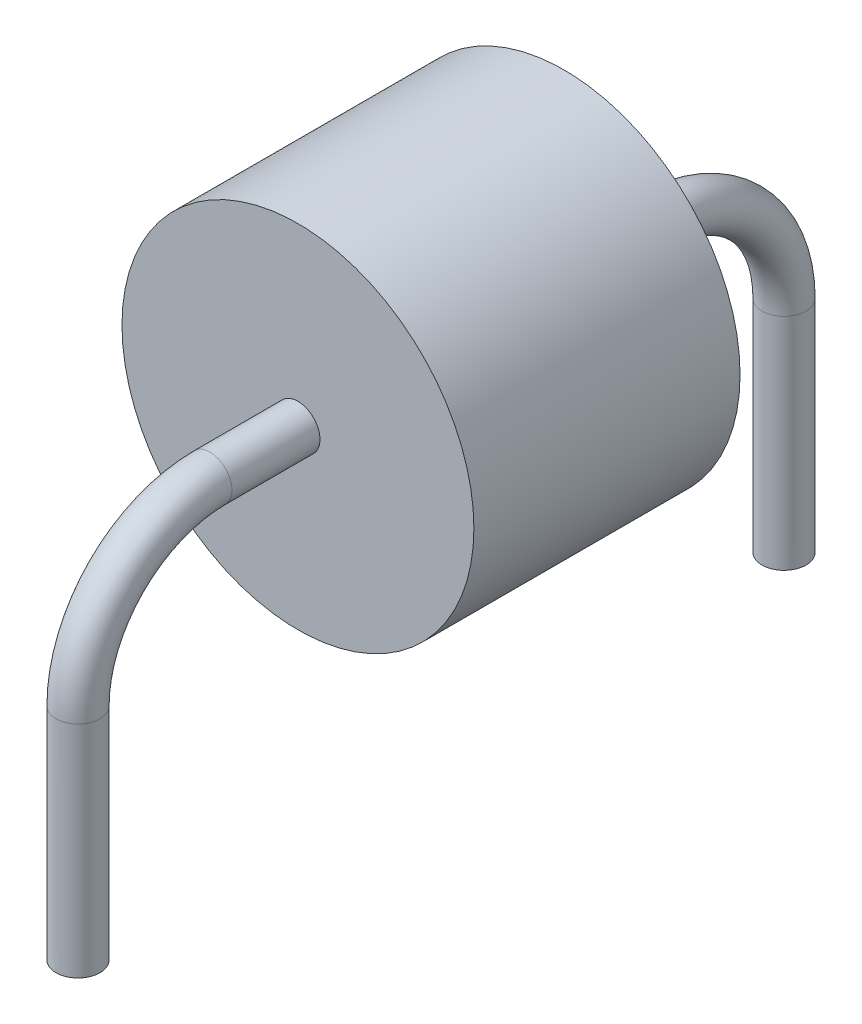
ISO-10303-21;
HEADER;
FILE_DESCRIPTION(('STEP AP214'),'2;1');
FILE_NAME('part.step','',(''),(''),'','','');
FILE_SCHEMA(('AUTOMOTIVE_DESIGN { 1 0 10303 214 1 1 1 1 }'));
ENDSEC;
DATA;
#1=APPLICATION_CONTEXT('core data for automotive mechanical design processes');
#2=APPLICATION_PROTOCOL_DEFINITION('international standard','automotive_design',2000,#1);
#3=PRODUCT_CONTEXT('',#1,'mechanical');
#4=PRODUCT('Part','Part','',(#3));
#5=PRODUCT_RELATED_PRODUCT_CATEGORY('part','',(#4));
#6=PRODUCT_DEFINITION_FORMATION('','',#4);
#7=PRODUCT_DEFINITION_CONTEXT('part definition',#1,'design');
#8=PRODUCT_DEFINITION('design','',#6,#7);
#9=PRODUCT_DEFINITION_SHAPE('','',#8);
#10=(LENGTH_UNIT() NAMED_UNIT(*) SI_UNIT(.MILLI.,.METRE.));
#11=(NAMED_UNIT(*) PLANE_ANGLE_UNIT() SI_UNIT($,.RADIAN.));
#12=(NAMED_UNIT(*) SI_UNIT($,.STERADIAN.) SOLID_ANGLE_UNIT());
#13=UNCERTAINTY_MEASURE_WITH_UNIT(LENGTH_MEASURE(1.E-05),#10,'distance_accuracy_value','');
#14=(GEOMETRIC_REPRESENTATION_CONTEXT(3) GLOBAL_UNCERTAINTY_ASSIGNED_CONTEXT((#13)) GLOBAL_UNIT_ASSIGNED_CONTEXT((#10,
#11,#12)) REPRESENTATION_CONTEXT('',''));
#15=CARTESIAN_POINT('',(0.,0.,0.));
#16=DIRECTION('',(0.,0.,1.));
#17=DIRECTION('',(1.,0.,0.));
#18=AXIS2_PLACEMENT_3D('',#15,#16,#17);
#19=CARTESIAN_POINT('',(0.,0.,3.025));
#20=DIRECTION('',(0.,0.,-1.));
#21=DIRECTION('',(-1.,0.,0.));
#22=AXIS2_PLACEMENT_3D('',#19,#20,#21);
#23=CYLINDRICAL_SURFACE('',#22,4.);
#24=CARTESIAN_POINT('',(0.,0.,3.025));
#25=DIRECTION('',(0.,0.,1.));
#26=DIRECTION('',(1.,0.,0.));
#27=AXIS2_PLACEMENT_3D('',#24,#25,#26);
#28=CIRCLE('',#27,4.);
#29=CARTESIAN_POINT('',(4.,0.,3.025));
#30=VERTEX_POINT('',#29);
#31=EDGE_CURVE('E39',#30,#30,#28,.T.);
#32=ORIENTED_EDGE('',*,*,#31,.F.);
#33=EDGE_LOOP('',(#32));
#34=FACE_BOUND('',#33,.T.);
#35=CARTESIAN_POINT('',(0.,0.,-3.025));
#36=DIRECTION('',(0.,0.,1.));
#37=DIRECTION('',(1.,0.,0.));
#38=AXIS2_PLACEMENT_3D('',#35,#36,#37);
#39=CIRCLE('',#38,4.);
#40=CARTESIAN_POINT('',(4.,0.,-3.025));
#41=VERTEX_POINT('',#40);
#42=EDGE_CURVE('E43',#41,#41,#39,.T.);
#43=ORIENTED_EDGE('',*,*,#42,.T.);
#44=EDGE_LOOP('',(#43));
#45=FACE_BOUND('',#44,.T.);
#46=ADVANCED_FACE('F33',(#34,#45),#23,.T.);
#47=CARTESIAN_POINT('',(0.,0.,3.025));
#48=DIRECTION('',(0.,0.,1.));
#49=DIRECTION('',(1.,0.,0.));
#50=AXIS2_PLACEMENT_3D('',#47,#48,#49);
#51=PLANE('',#50);
#52=CARTESIAN_POINT('',(0.,0.,3.025));
#53=DIRECTION('',(0.,0.,1.));
#54=DIRECTION('',(1.,0.,0.));
#55=AXIS2_PLACEMENT_3D('',#52,#53,#54);
#56=CIRCLE('',#55,0.5);
#57=CARTESIAN_POINT('',(0.5,0.,3.025));
#58=VERTEX_POINT('',#57);
#59=EDGE_CURVE('E10',#58,#58,#56,.T.);
#60=ORIENTED_EDGE('',*,*,#59,.F.);
#61=EDGE_LOOP('',(#60));
#62=FACE_BOUND('',#61,.T.);
#63=ORIENTED_EDGE('',*,*,#31,.T.);
#64=EDGE_LOOP('',(#63));
#65=FACE_BOUND('',#64,.T.);
#66=ADVANCED_FACE('F77',(#62,#65),#51,.T.);
#67=CARTESIAN_POINT('',(0.,0.,-3.025));
#68=DIRECTION('',(0.,0.,1.));
#69=DIRECTION('',(1.,0.,0.));
#70=AXIS2_PLACEMENT_3D('',#67,#68,#69);
#71=PLANE('',#70);
#72=CARTESIAN_POINT('',(0.,0.,-3.025));
#73=DIRECTION('',(0.,0.,1.));
#74=DIRECTION('',(1.,0.,0.));
#75=AXIS2_PLACEMENT_3D('',#72,#73,#74);
#76=CIRCLE('',#75,0.5);
#77=CARTESIAN_POINT('',(0.5,0.,-3.025));
#78=VERTEX_POINT('',#77);
#79=EDGE_CURVE('E67',#78,#78,#76,.F.);
#80=ORIENTED_EDGE('',*,*,#79,.F.);
#81=EDGE_LOOP('',(#80));
#82=FACE_BOUND('',#81,.T.);
#83=ORIENTED_EDGE('',*,*,#42,.F.);
#84=EDGE_LOOP('',(#83));
#85=FACE_BOUND('',#84,.T.);
#86=ADVANCED_FACE('F73',(#82,#85),#71,.F.);
#87=CARTESIAN_POINT('',(0.,-8.,8.025));
#88=DIRECTION('',(0.,-1.,0.));
#89=DIRECTION('',(1.,0.,0.));
#90=AXIS2_PLACEMENT_3D('',#87,#88,#89);
#91=PLANE('',#90);
#92=CARTESIAN_POINT('',(0.,-8.,8.025));
#93=DIRECTION('',(0.,-1.,0.));
#94=DIRECTION('',(1.,0.,0.));
#95=AXIS2_PLACEMENT_3D('',#92,#93,#94);
#96=CIRCLE('',#95,0.5);
#97=CARTESIAN_POINT('',(0.5,-8.,8.025));
#98=VERTEX_POINT('',#97);
#99=EDGE_CURVE('E48',#98,#98,#96,.T.);
#100=ORIENTED_EDGE('',*,*,#99,.T.);
#101=EDGE_LOOP('',(#100));
#102=FACE_BOUND('',#101,.T.);
#103=ADVANCED_FACE('F76',(#102),#91,.T.);
#104=CARTESIAN_POINT('',(0.,0.,3.025));
#105=DIRECTION('',(0.,0.,1.));
#106=DIRECTION('',(0.,-1.,0.));
#107=AXIS2_PLACEMENT_3D('',#104,#105,#106);
#108=CYLINDRICAL_SURFACE('',#107,0.5);
#109=CARTESIAN_POINT('',(0.,0.,5.025));
#110=DIRECTION('',(0.,0.,1.));
#111=DIRECTION('',(1.,0.,0.));
#112=AXIS2_PLACEMENT_3D('',#109,#110,#111);
#113=CIRCLE('',#112,0.5);
#114=CARTESIAN_POINT('',(0.,0.499999999999998,5.025));
#115=VERTEX_POINT('',#114);
#116=EDGE_CURVE('E55',#115,#115,#113,.T.);
#117=ORIENTED_EDGE('',*,*,#116,.F.);
#118=EDGE_LOOP('',(#117));
#119=FACE_BOUND('',#118,.T.);
#120=ORIENTED_EDGE('',*,*,#59,.T.);
#121=EDGE_LOOP('',(#120));
#122=FACE_BOUND('',#121,.T.);
#123=ADVANCED_FACE('F93',(#119,#122),#108,.T.);
#124=CARTESIAN_POINT('',(0.,-3.,5.025));
#125=DIRECTION('',(1.,0.,0.));
#126=DIRECTION('',(0.,0.,-1.));
#127=AXIS2_PLACEMENT_3D('',#124,#125,#126);
#128=TOROIDAL_SURFACE('',#127,3.,0.5);
#129=CARTESIAN_POINT('',(0.,-3.,8.025));
#130=DIRECTION('',(0.,-1.,0.));
#131=DIRECTION('',(1.,0.,0.));
#132=AXIS2_PLACEMENT_3D('',#129,#130,#131);
#133=CIRCLE('',#132,0.5);
#134=CARTESIAN_POINT('',(0.,-3.,8.525));
#135=VERTEX_POINT('',#134);
#136=EDGE_CURVE('E52',#135,#135,#133,.T.);
#137=CARTESIAN_POINT('',(0.,-3.,5.025));
#138=DIRECTION('',(1.,0.,0.));
#139=DIRECTION('',(0.,0.,-1.));
#140=AXIS2_PLACEMENT_3D('',#137,#138,#139);
#141=CIRCLE('',#140,3.5);
#142=EDGE_CURVE('',#115,#135,#141,.T.);
#143=ORIENTED_EDGE('',*,*,#116,.T.);
#144=ORIENTED_EDGE('',*,*,#136,.F.);
#145=ORIENTED_EDGE('',*,*,#142,.T.);
#146=ORIENTED_EDGE('',*,*,#142,.F.);
#147=EDGE_LOOP('',(#143,#145,#144,#146));
#148=FACE_BOUND('',#147,.T.);
#149=ADVANCED_FACE('F99',(#148),#128,.T.);
#150=CARTESIAN_POINT('',(0.,-3.,8.025));
#151=DIRECTION('',(0.,-1.,0.));
#152=DIRECTION('',(0.,0.,-1.));
#153=AXIS2_PLACEMENT_3D('',#150,#151,#152);
#154=CYLINDRICAL_SURFACE('',#153,0.5);
#155=ORIENTED_EDGE('',*,*,#99,.F.);
#156=EDGE_LOOP('',(#155));
#157=FACE_BOUND('',#156,.T.);
#158=ORIENTED_EDGE('',*,*,#136,.T.);
#159=EDGE_LOOP('',(#158));
#160=FACE_BOUND('',#159,.T.);
#161=ADVANCED_FACE('F78',(#157,#160),#154,.T.);
#162=CARTESIAN_POINT('',(0.,-8.,-8.025));
#163=DIRECTION('',(0.,-1.,0.));
#164=DIRECTION('',(1.,0.,0.));
#165=AXIS2_PLACEMENT_3D('',#162,#163,#164);
#166=PLANE('',#165);
#167=CARTESIAN_POINT('',(0.,-8.,-8.025));
#168=DIRECTION('',(0.,1.,0.));
#169=DIRECTION('',(1.,0.,0.));
#170=AXIS2_PLACEMENT_3D('',#167,#168,#169);
#171=CIRCLE('',#170,0.5);
#172=CARTESIAN_POINT('',(0.5,-8.,-8.025));
#173=VERTEX_POINT('',#172);
#174=EDGE_CURVE('E58',#173,#173,#171,.F.);
#175=ORIENTED_EDGE('',*,*,#174,.T.);
#176=EDGE_LOOP('',(#175));
#177=FACE_BOUND('',#176,.T.);
#178=ADVANCED_FACE('F98',(#177),#166,.T.);
#179=CARTESIAN_POINT('',(0.,0.,-3.025));
#180=DIRECTION('',(0.,0.,-1.));
#181=DIRECTION('',(0.,1.,0.));
#182=AXIS2_PLACEMENT_3D('',#179,#180,#181);
#183=CYLINDRICAL_SURFACE('',#182,0.5);
#184=CARTESIAN_POINT('',(0.,0.,-5.025));
#185=DIRECTION('',(0.,0.,1.));
#186=DIRECTION('',(1.,0.,0.));
#187=AXIS2_PLACEMENT_3D('',#184,#185,#186);
#188=CIRCLE('',#187,0.5);
#189=CARTESIAN_POINT('',(0.,0.499999999999998,-5.025));
#190=VERTEX_POINT('',#189);
#191=EDGE_CURVE('E64',#190,#190,#188,.F.);
#192=ORIENTED_EDGE('',*,*,#191,.F.);
#193=EDGE_LOOP('',(#192));
#194=FACE_BOUND('',#193,.T.);
#195=ORIENTED_EDGE('',*,*,#79,.T.);
#196=EDGE_LOOP('',(#195));
#197=FACE_BOUND('',#196,.T.);
#198=ADVANCED_FACE('F71',(#194,#197),#183,.T.);
#199=CARTESIAN_POINT('',(0.,-3.,-5.025));
#200=DIRECTION('',(-1.,0.,0.));
#201=DIRECTION('',(0.,0.,1.));
#202=AXIS2_PLACEMENT_3D('',#199,#200,#201);
#203=TOROIDAL_SURFACE('',#202,3.,0.5);
#204=CARTESIAN_POINT('',(0.,-3.,-8.025));
#205=DIRECTION('',(0.,1.,0.));
#206=DIRECTION('',(1.,0.,0.));
#207=AXIS2_PLACEMENT_3D('',#204,#205,#206);
#208=CIRCLE('',#207,0.5);
#209=CARTESIAN_POINT('',(0.,-3.,-8.525));
#210=VERTEX_POINT('',#209);
#211=EDGE_CURVE('E61',#210,#210,#208,.F.);
#212=CARTESIAN_POINT('',(0.,-3.,-5.025));
#213=DIRECTION('',(-1.,0.,0.));
#214=DIRECTION('',(0.,0.,1.));
#215=AXIS2_PLACEMENT_3D('',#212,#213,#214);
#216=CIRCLE('',#215,3.5);
#217=EDGE_CURVE('',#190,#210,#216,.T.);
#218=ORIENTED_EDGE('',*,*,#191,.T.);
#219=ORIENTED_EDGE('',*,*,#211,.F.);
#220=ORIENTED_EDGE('',*,*,#217,.T.);
#221=ORIENTED_EDGE('',*,*,#217,.F.);
#222=EDGE_LOOP('',(#218,#220,#219,#221));
#223=FACE_BOUND('',#222,.T.);
#224=ADVANCED_FACE('F112',(#223),#203,.T.);
#225=CARTESIAN_POINT('',(0.,-3.,-8.025));
#226=DIRECTION('',(0.,-1.,0.));
#227=DIRECTION('',(0.,0.,-1.));
#228=AXIS2_PLACEMENT_3D('',#225,#226,#227);
#229=CYLINDRICAL_SURFACE('',#228,0.5);
#230=ORIENTED_EDGE('',*,*,#174,.F.);
#231=EDGE_LOOP('',(#230));
#232=FACE_BOUND('',#231,.T.);
#233=ORIENTED_EDGE('',*,*,#211,.T.);
#234=EDGE_LOOP('',(#233));
#235=FACE_BOUND('',#234,.T.);
#236=ADVANCED_FACE('F95',(#232,#235),#229,.T.);
#237=CLOSED_SHELL('',(#46,#66,#86,#103,#123,#149,#161,#178,#198,#224,#236));
#238=MANIFOLD_SOLID_BREP('B2',#237);
#239=ADVANCED_BREP_SHAPE_REPRESENTATION('',(#18,#238),#14);
#240=SHAPE_DEFINITION_REPRESENTATION(#9,#239);
ENDSEC;
END-ISO-10303-21;
